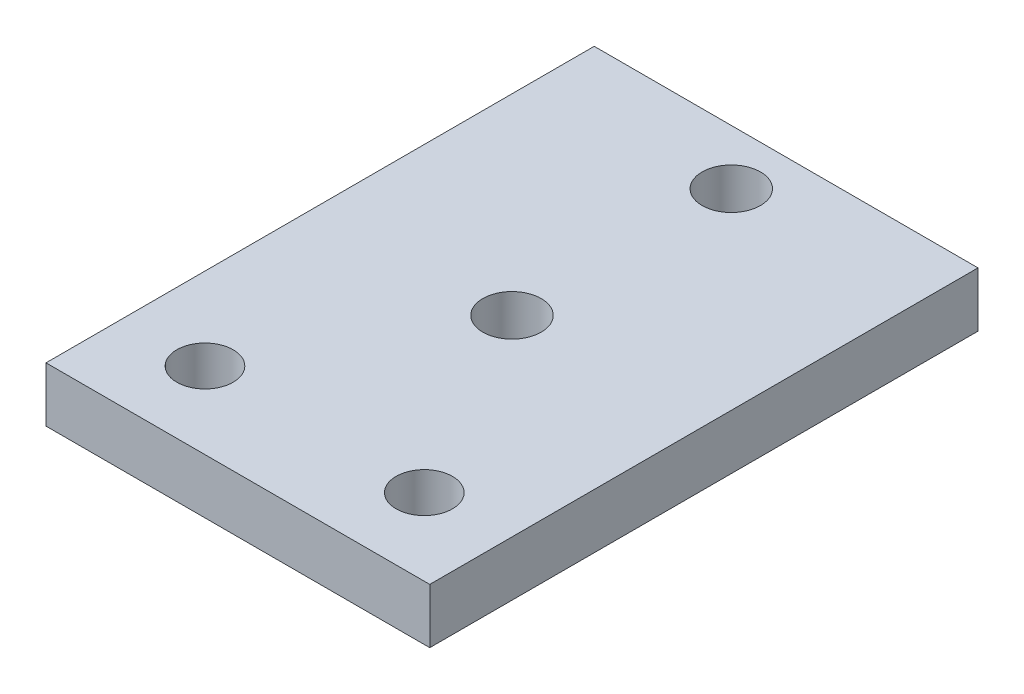
ISO-10303-21;
HEADER;
FILE_DESCRIPTION(('STEP AP214'),'2;1');
FILE_NAME('part.step','',(''),(''),'','','');
FILE_SCHEMA(('AUTOMOTIVE_DESIGN { 1 0 10303 214 1 1 1 1 }'));
ENDSEC;
DATA;
#1=APPLICATION_CONTEXT('core data for automotive mechanical design processes');
#2=APPLICATION_PROTOCOL_DEFINITION('international standard','automotive_design',2000,#1);
#3=PRODUCT_CONTEXT('',#1,'mechanical');
#4=PRODUCT('Part','Part','',(#3));
#5=PRODUCT_RELATED_PRODUCT_CATEGORY('part','',(#4));
#6=PRODUCT_DEFINITION_FORMATION('','',#4);
#7=PRODUCT_DEFINITION_CONTEXT('part definition',#1,'design');
#8=PRODUCT_DEFINITION('design','',#6,#7);
#9=PRODUCT_DEFINITION_SHAPE('','',#8);
#10=(LENGTH_UNIT() NAMED_UNIT(*) SI_UNIT(.MILLI.,.METRE.));
#11=(NAMED_UNIT(*) PLANE_ANGLE_UNIT() SI_UNIT($,.RADIAN.));
#12=(NAMED_UNIT(*) SI_UNIT($,.STERADIAN.) SOLID_ANGLE_UNIT());
#13=UNCERTAINTY_MEASURE_WITH_UNIT(LENGTH_MEASURE(1.E-05),#10,'distance_accuracy_value','');
#14=(GEOMETRIC_REPRESENTATION_CONTEXT(3) GLOBAL_UNCERTAINTY_ASSIGNED_CONTEXT((#13)) GLOBAL_UNIT_ASSIGNED_CONTEXT((#10,
#11,#12)) REPRESENTATION_CONTEXT('',''));
#15=CARTESIAN_POINT('',(0.,0.,0.));
#16=DIRECTION('',(0.,0.,1.));
#17=DIRECTION('',(1.,0.,0.));
#18=AXIS2_PLACEMENT_3D('',#15,#16,#17);
#19=CARTESIAN_POINT('',(22.225,6.35,31.75));
#20=DIRECTION('',(-1.,0.,0.));
#21=DIRECTION('',(0.,0.,1.));
#22=AXIS2_PLACEMENT_3D('',#19,#20,#21);
#23=PLANE('',#22);
#24=DIRECTION('',(0.,0.,-1.));
#25=VECTOR('',#24,1.);
#26=CARTESIAN_POINT('',(22.225,0.,31.75));
#27=LINE('',#26,#25);
#28=CARTESIAN_POINT('',(22.225,0.,31.75));
#29=VERTEX_POINT('',#28);
#30=CARTESIAN_POINT('',(22.225,0.,-31.75));
#31=VERTEX_POINT('',#30);
#32=EDGE_CURVE('E109',#29,#31,#27,.T.);
#33=ORIENTED_EDGE('',*,*,#32,.T.);
#34=DIRECTION('',(0.,-1.,0.));
#35=VECTOR('',#34,1.);
#36=CARTESIAN_POINT('',(22.225,6.35,-31.75));
#37=LINE('',#36,#35);
#38=CARTESIAN_POINT('',(22.225,6.35,-31.75));
#39=VERTEX_POINT('',#38);
#40=EDGE_CURVE('E11',#39,#31,#37,.T.);
#41=ORIENTED_EDGE('',*,*,#40,.F.);
#42=DIRECTION('',(0.,0.,-1.));
#43=VECTOR('',#42,1.);
#44=CARTESIAN_POINT('',(22.225,6.35,31.75));
#45=LINE('',#44,#43);
#46=CARTESIAN_POINT('',(22.225,6.35,31.75));
#47=VERTEX_POINT('',#46);
#48=EDGE_CURVE('E93',#47,#39,#45,.T.);
#49=ORIENTED_EDGE('',*,*,#48,.F.);
#50=DIRECTION('',(0.,-1.,0.));
#51=VECTOR('',#50,1.);
#52=CARTESIAN_POINT('',(22.225,6.35,31.75));
#53=LINE('',#52,#51);
#54=EDGE_CURVE('E105',#47,#29,#53,.T.);
#55=ORIENTED_EDGE('',*,*,#54,.T.);
#56=EDGE_LOOP('',(#33,#41,#49,#55));
#57=FACE_BOUND('',#56,.T.);
#58=ADVANCED_FACE('F41',(#57),#23,.F.);
#59=CARTESIAN_POINT('',(-22.225,6.35,-31.75));
#60=DIRECTION('',(0.,0.,1.));
#61=DIRECTION('',(1.,0.,0.));
#62=AXIS2_PLACEMENT_3D('',#59,#60,#61);
#63=PLANE('',#62);
#64=DIRECTION('',(-1.,0.,0.));
#65=VECTOR('',#64,1.);
#66=CARTESIAN_POINT('',(-22.225,0.,-31.75));
#67=LINE('',#66,#65);
#68=CARTESIAN_POINT('',(-22.225,0.,-31.75));
#69=VERTEX_POINT('',#68);
#70=EDGE_CURVE('E98',#31,#69,#67,.T.);
#71=ORIENTED_EDGE('',*,*,#70,.T.);
#72=DIRECTION('',(0.,-1.,0.));
#73=VECTOR('',#72,1.);
#74=CARTESIAN_POINT('',(-22.225,6.35,-31.75));
#75=LINE('',#74,#73);
#76=CARTESIAN_POINT('',(-22.225,6.35,-31.75));
#77=VERTEX_POINT('',#76);
#78=EDGE_CURVE('E50',#77,#69,#75,.T.);
#79=ORIENTED_EDGE('',*,*,#78,.F.);
#80=DIRECTION('',(-1.,0.,0.));
#81=VECTOR('',#80,1.);
#82=CARTESIAN_POINT('',(-22.225,6.35,-31.75));
#83=LINE('',#82,#81);
#84=EDGE_CURVE('E88',#39,#77,#83,.T.);
#85=ORIENTED_EDGE('',*,*,#84,.F.);
#86=ORIENTED_EDGE('',*,*,#40,.T.);
#87=EDGE_LOOP('',(#71,#79,#85,#86));
#88=FACE_BOUND('',#87,.T.);
#89=ADVANCED_FACE('F97',(#88),#63,.F.);
#90=CARTESIAN_POINT('',(-22.225,6.35,31.75));
#91=DIRECTION('',(1.,0.,0.));
#92=DIRECTION('',(0.,0.,-1.));
#93=AXIS2_PLACEMENT_3D('',#90,#91,#92);
#94=PLANE('',#93);
#95=DIRECTION('',(0.,0.,1.));
#96=VECTOR('',#95,1.);
#97=CARTESIAN_POINT('',(-22.225,0.,31.75));
#98=LINE('',#97,#96);
#99=CARTESIAN_POINT('',(-22.225,0.,31.75));
#100=VERTEX_POINT('',#99);
#101=EDGE_CURVE('E75',#69,#100,#98,.T.);
#102=ORIENTED_EDGE('',*,*,#101,.T.);
#103=DIRECTION('',(0.,-1.,0.));
#104=VECTOR('',#103,1.);
#105=CARTESIAN_POINT('',(-22.225,6.35,31.75));
#106=LINE('',#105,#104);
#107=CARTESIAN_POINT('',(-22.225,6.35,31.75));
#108=VERTEX_POINT('',#107);
#109=EDGE_CURVE('E100',#108,#100,#106,.T.);
#110=ORIENTED_EDGE('',*,*,#109,.F.);
#111=DIRECTION('',(0.,0.,1.));
#112=VECTOR('',#111,1.);
#113=CARTESIAN_POINT('',(-22.225,6.35,31.75));
#114=LINE('',#113,#112);
#115=EDGE_CURVE('E91',#77,#108,#114,.T.);
#116=ORIENTED_EDGE('',*,*,#115,.F.);
#117=ORIENTED_EDGE('',*,*,#78,.T.);
#118=EDGE_LOOP('',(#102,#110,#116,#117));
#119=FACE_BOUND('',#118,.T.);
#120=ADVANCED_FACE('F101',(#119),#94,.F.);
#121=CARTESIAN_POINT('',(-22.225,6.35,31.75));
#122=DIRECTION('',(0.,0.,-1.));
#123=DIRECTION('',(-1.,0.,0.));
#124=AXIS2_PLACEMENT_3D('',#121,#122,#123);
#125=PLANE('',#124);
#126=DIRECTION('',(1.,0.,0.));
#127=VECTOR('',#126,1.);
#128=CARTESIAN_POINT('',(-22.225,0.,31.75));
#129=LINE('',#128,#127);
#130=EDGE_CURVE('E81',#100,#29,#129,.T.);
#131=ORIENTED_EDGE('',*,*,#130,.T.);
#132=ORIENTED_EDGE('',*,*,#54,.F.);
#133=DIRECTION('',(1.,0.,0.));
#134=VECTOR('',#133,1.);
#135=CARTESIAN_POINT('',(-22.225,6.35,31.75));
#136=LINE('',#135,#134);
#137=EDGE_CURVE('E58',#108,#47,#136,.T.);
#138=ORIENTED_EDGE('',*,*,#137,.F.);
#139=ORIENTED_EDGE('',*,*,#109,.T.);
#140=EDGE_LOOP('',(#131,#132,#138,#139));
#141=FACE_BOUND('',#140,.T.);
#142=ADVANCED_FACE('F123',(#141),#125,.F.);
#143=CARTESIAN_POINT('',(0.,6.35,0.));
#144=DIRECTION('',(0.,-1.,0.));
#145=DIRECTION('',(0.,0.,-1.));
#146=AXIS2_PLACEMENT_3D('',#143,#144,#145);
#147=PLANE('',#146);
#148=CARTESIAN_POINT('',(-12.7,6.35,22.86));
#149=DIRECTION('',(0.,1.,0.));
#150=DIRECTION('',(0.,0.,1.));
#151=AXIS2_PLACEMENT_3D('',#148,#149,#150);
#152=CIRCLE('',#151,3.2639);
#153=CARTESIAN_POINT('',(-12.7,6.35,26.1239));
#154=VERTEX_POINT('',#153);
#155=EDGE_CURVE('E157',#154,#154,#152,.T.);
#156=ORIENTED_EDGE('',*,*,#155,.F.);
#157=EDGE_LOOP('',(#156));
#158=FACE_BOUND('',#157,.T.);
#159=CARTESIAN_POINT('',(12.7,6.35,22.86));
#160=DIRECTION('',(0.,1.,0.));
#161=DIRECTION('',(0.,0.,1.));
#162=AXIS2_PLACEMENT_3D('',#159,#160,#161);
#163=CIRCLE('',#162,3.2639);
#164=CARTESIAN_POINT('',(12.7,6.35,26.1239));
#165=VERTEX_POINT('',#164);
#166=EDGE_CURVE('E149',#165,#165,#163,.T.);
#167=ORIENTED_EDGE('',*,*,#166,.F.);
#168=EDGE_LOOP('',(#167));
#169=FACE_BOUND('',#168,.T.);
#170=CARTESIAN_POINT('',(0.,6.35,-25.4));
#171=DIRECTION('',(0.,1.,0.));
#172=DIRECTION('',(0.,0.,1.));
#173=AXIS2_PLACEMENT_3D('',#170,#171,#172);
#174=CIRCLE('',#173,3.3782);
#175=CARTESIAN_POINT('',(0.,6.35,-22.0218));
#176=VERTEX_POINT('',#175);
#177=EDGE_CURVE('E141',#176,#176,#174,.T.);
#178=ORIENTED_EDGE('',*,*,#177,.F.);
#179=EDGE_LOOP('',(#178));
#180=FACE_BOUND('',#179,.T.);
#181=CARTESIAN_POINT('',(0.,6.35,0.));
#182=DIRECTION('',(0.,1.,0.));
#183=DIRECTION('',(0.,0.,1.));
#184=AXIS2_PLACEMENT_3D('',#181,#182,#183);
#185=CIRCLE('',#184,3.3782);
#186=CARTESIAN_POINT('',(0.,6.35,3.37819999999999));
#187=VERTEX_POINT('',#186);
#188=EDGE_CURVE('E133',#187,#187,#185,.T.);
#189=ORIENTED_EDGE('',*,*,#188,.F.);
#190=EDGE_LOOP('',(#189));
#191=FACE_BOUND('',#190,.T.);
#192=ORIENTED_EDGE('',*,*,#48,.T.);
#193=ORIENTED_EDGE('',*,*,#84,.T.);
#194=ORIENTED_EDGE('',*,*,#115,.T.);
#195=ORIENTED_EDGE('',*,*,#137,.T.);
#196=EDGE_LOOP('',(#192,#193,#194,#195));
#197=FACE_BOUND('',#196,.T.);
#198=ADVANCED_FACE('F89',(#158,#169,#180,#191,#197),#147,.F.);
#199=CARTESIAN_POINT('',(0.,0.,0.));
#200=DIRECTION('',(0.,-1.,0.));
#201=DIRECTION('',(0.,0.,-1.));
#202=AXIS2_PLACEMENT_3D('',#199,#200,#201);
#203=PLANE('',#202);
#204=CARTESIAN_POINT('',(-12.7,0.,22.86));
#205=DIRECTION('',(0.,1.,0.));
#206=DIRECTION('',(0.,0.,1.));
#207=AXIS2_PLACEMENT_3D('',#204,#205,#206);
#208=CIRCLE('',#207,3.2639);
#209=CARTESIAN_POINT('',(-12.7,0.,26.1239));
#210=VERTEX_POINT('',#209);
#211=EDGE_CURVE('E153',#210,#210,#208,.T.);
#212=ORIENTED_EDGE('',*,*,#211,.T.);
#213=EDGE_LOOP('',(#212));
#214=FACE_BOUND('',#213,.T.);
#215=CARTESIAN_POINT('',(12.7,0.,22.86));
#216=DIRECTION('',(0.,1.,0.));
#217=DIRECTION('',(0.,0.,1.));
#218=AXIS2_PLACEMENT_3D('',#215,#216,#217);
#219=CIRCLE('',#218,3.2639);
#220=CARTESIAN_POINT('',(12.7,0.,26.1239));
#221=VERTEX_POINT('',#220);
#222=EDGE_CURVE('E145',#221,#221,#219,.T.);
#223=ORIENTED_EDGE('',*,*,#222,.T.);
#224=EDGE_LOOP('',(#223));
#225=FACE_BOUND('',#224,.T.);
#226=CARTESIAN_POINT('',(0.,0.,-25.4));
#227=DIRECTION('',(0.,1.,0.));
#228=DIRECTION('',(0.,0.,1.));
#229=AXIS2_PLACEMENT_3D('',#226,#227,#228);
#230=CIRCLE('',#229,3.3782);
#231=CARTESIAN_POINT('',(0.,0.,-22.0218));
#232=VERTEX_POINT('',#231);
#233=EDGE_CURVE('E137',#232,#232,#230,.T.);
#234=ORIENTED_EDGE('',*,*,#233,.T.);
#235=EDGE_LOOP('',(#234));
#236=FACE_BOUND('',#235,.T.);
#237=CARTESIAN_POINT('',(0.,0.,0.));
#238=DIRECTION('',(0.,1.,0.));
#239=DIRECTION('',(0.,0.,1.));
#240=AXIS2_PLACEMENT_3D('',#237,#238,#239);
#241=CIRCLE('',#240,3.3782);
#242=CARTESIAN_POINT('',(0.,0.,3.37819999999999));
#243=VERTEX_POINT('',#242);
#244=EDGE_CURVE('E113',#243,#243,#241,.T.);
#245=ORIENTED_EDGE('',*,*,#244,.T.);
#246=EDGE_LOOP('',(#245));
#247=FACE_BOUND('',#246,.T.);
#248=ORIENTED_EDGE('',*,*,#32,.F.);
#249=ORIENTED_EDGE('',*,*,#130,.F.);
#250=ORIENTED_EDGE('',*,*,#101,.F.);
#251=ORIENTED_EDGE('',*,*,#70,.F.);
#252=EDGE_LOOP('',(#248,#249,#250,#251));
#253=FACE_BOUND('',#252,.T.);
#254=ADVANCED_FACE('F126',(#214,#225,#236,#247,#253),#203,.T.);
#255=CARTESIAN_POINT('',(0.,6.35,0.));
#256=DIRECTION('',(0.,1.,0.));
#257=DIRECTION('',(0.,0.,1.));
#258=AXIS2_PLACEMENT_3D('',#255,#256,#257);
#259=CYLINDRICAL_SURFACE('',#258,3.3782);
#260=ORIENTED_EDGE('',*,*,#244,.F.);
#261=EDGE_LOOP('',(#260));
#262=FACE_BOUND('',#261,.T.);
#263=ORIENTED_EDGE('',*,*,#188,.T.);
#264=EDGE_LOOP('',(#263));
#265=FACE_BOUND('',#264,.T.);
#266=ADVANCED_FACE('F173',(#262,#265),#259,.F.);
#267=CARTESIAN_POINT('',(0.,6.35,-25.4));
#268=DIRECTION('',(0.,1.,0.));
#269=DIRECTION('',(0.,0.,1.));
#270=AXIS2_PLACEMENT_3D('',#267,#268,#269);
#271=CYLINDRICAL_SURFACE('',#270,3.3782);
#272=ORIENTED_EDGE('',*,*,#233,.F.);
#273=EDGE_LOOP('',(#272));
#274=FACE_BOUND('',#273,.T.);
#275=ORIENTED_EDGE('',*,*,#177,.T.);
#276=EDGE_LOOP('',(#275));
#277=FACE_BOUND('',#276,.T.);
#278=ADVANCED_FACE('F175',(#274,#277),#271,.F.);
#279=CARTESIAN_POINT('',(12.7,6.35,22.86));
#280=DIRECTION('',(0.,1.,0.));
#281=DIRECTION('',(0.,0.,1.));
#282=AXIS2_PLACEMENT_3D('',#279,#280,#281);
#283=CYLINDRICAL_SURFACE('',#282,3.2639);
#284=ORIENTED_EDGE('',*,*,#222,.F.);
#285=EDGE_LOOP('',(#284));
#286=FACE_BOUND('',#285,.T.);
#287=ORIENTED_EDGE('',*,*,#166,.T.);
#288=EDGE_LOOP('',(#287));
#289=FACE_BOUND('',#288,.T.);
#290=ADVANCED_FACE('F182',(#286,#289),#283,.F.);
#291=CARTESIAN_POINT('',(-12.7,6.35,22.86));
#292=DIRECTION('',(0.,1.,0.));
#293=DIRECTION('',(0.,0.,1.));
#294=AXIS2_PLACEMENT_3D('',#291,#292,#293);
#295=CYLINDRICAL_SURFACE('',#294,3.2639);
#296=ORIENTED_EDGE('',*,*,#211,.F.);
#297=EDGE_LOOP('',(#296));
#298=FACE_BOUND('',#297,.T.);
#299=ORIENTED_EDGE('',*,*,#155,.T.);
#300=EDGE_LOOP('',(#299));
#301=FACE_BOUND('',#300,.T.);
#302=ADVANCED_FACE('F162',(#298,#301),#295,.F.);
#303=CLOSED_SHELL('',(#58,#89,#120,#142,#198,#254,#266,#278,#290,#302));
#304=MANIFOLD_SOLID_BREP('B2',#303);
#305=ADVANCED_BREP_SHAPE_REPRESENTATION('',(#18,#304),#14);
#306=SHAPE_DEFINITION_REPRESENTATION(#9,#305);
ENDSEC;
END-ISO-10303-21;
